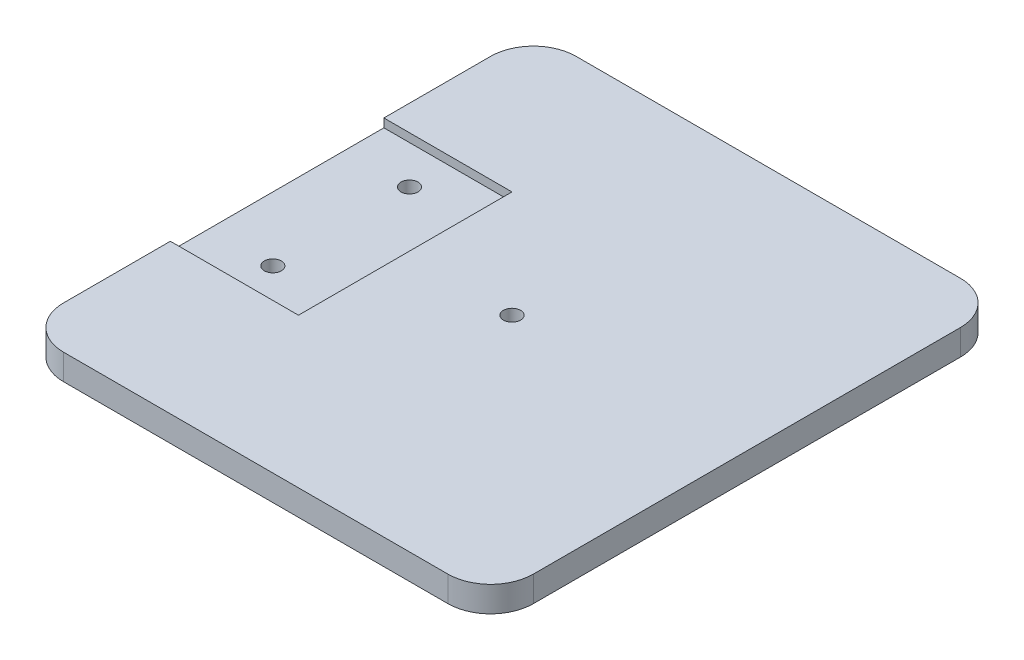
ISO-10303-21;
HEADER;
FILE_DESCRIPTION(('STEP AP214'),'2;1');
FILE_NAME('part.step','',(''),(''),'','','');
FILE_SCHEMA(('AUTOMOTIVE_DESIGN { 1 0 10303 214 1 1 1 1 }'));
ENDSEC;
DATA;
#1=APPLICATION_CONTEXT('core data for automotive mechanical design processes');
#2=APPLICATION_PROTOCOL_DEFINITION('international standard','automotive_design',2000,#1);
#3=PRODUCT_CONTEXT('',#1,'mechanical');
#4=PRODUCT('Part','Part','',(#3));
#5=PRODUCT_RELATED_PRODUCT_CATEGORY('part','',(#4));
#6=PRODUCT_DEFINITION_FORMATION('','',#4);
#7=PRODUCT_DEFINITION_CONTEXT('part definition',#1,'design');
#8=PRODUCT_DEFINITION('design','',#6,#7);
#9=PRODUCT_DEFINITION_SHAPE('','',#8);
#10=(LENGTH_UNIT() NAMED_UNIT(*) SI_UNIT(.MILLI.,.METRE.));
#11=(NAMED_UNIT(*) PLANE_ANGLE_UNIT() SI_UNIT($,.RADIAN.));
#12=(NAMED_UNIT(*) SI_UNIT($,.STERADIAN.) SOLID_ANGLE_UNIT());
#13=UNCERTAINTY_MEASURE_WITH_UNIT(LENGTH_MEASURE(1.E-05),#10,'distance_accuracy_value','');
#14=(GEOMETRIC_REPRESENTATION_CONTEXT(3) GLOBAL_UNCERTAINTY_ASSIGNED_CONTEXT((#13)) GLOBAL_UNIT_ASSIGNED_CONTEXT((#10,
#11,#12)) REPRESENTATION_CONTEXT('',''));
#15=CARTESIAN_POINT('',(0.,0.,0.));
#16=DIRECTION('',(0.,0.,1.));
#17=DIRECTION('',(1.,0.,0.));
#18=AXIS2_PLACEMENT_3D('',#15,#16,#17);
#19=CARTESIAN_POINT('',(-78.125,3.,-24.375));
#20=DIRECTION('',(1.,0.,0.));
#21=DIRECTION('',(0.,0.,-1.));
#22=AXIS2_PLACEMENT_3D('',#19,#20,#21);
#23=PLANE('',#22);
#24=DIRECTION('',(0.,0.,1.));
#25=VECTOR('',#24,1.);
#26=CARTESIAN_POINT('',(-78.125,3.,-24.375));
#27=LINE('',#26,#25);
#28=CARTESIAN_POINT('',(-78.125,3.,-19.375));
#29=VERTEX_POINT('',#28);
#30=CARTESIAN_POINT('',(-78.125,3.,-6.875));
#31=VERTEX_POINT('',#30);
#32=EDGE_CURVE('E172',#29,#31,#27,.T.);
#33=ORIENTED_EDGE('',*,*,#32,.F.);
#34=DIRECTION('',(0.,-1.,0.));
#35=VECTOR('',#34,1.);
#36=CARTESIAN_POINT('',(-78.125,3.,-19.375));
#37=LINE('',#36,#35);
#38=CARTESIAN_POINT('',(-78.125,0.,-19.375));
#39=VERTEX_POINT('',#38);
#40=EDGE_CURVE('E214',#29,#39,#37,.T.);
#41=ORIENTED_EDGE('',*,*,#40,.T.);
#42=DIRECTION('',(0.,0.,1.));
#43=VECTOR('',#42,1.);
#44=CARTESIAN_POINT('',(-78.125,0.,-24.375));
#45=LINE('',#44,#43);
#46=CARTESIAN_POINT('',(-78.125,0.,30.625));
#47=VERTEX_POINT('',#46);
#48=EDGE_CURVE('E186',#39,#47,#45,.T.);
#49=ORIENTED_EDGE('',*,*,#48,.T.);
#50=DIRECTION('',(0.,-1.,0.));
#51=VECTOR('',#50,1.);
#52=CARTESIAN_POINT('',(-78.125,3.,30.625));
#53=LINE('',#52,#51);
#54=CARTESIAN_POINT('',(-78.125,3.,30.625));
#55=VERTEX_POINT('',#54);
#56=EDGE_CURVE('E185',#47,#55,#53,.F.);
#57=ORIENTED_EDGE('',*,*,#56,.T.);
#58=CARTESIAN_POINT('',(-78.125,3.,18.125));
#59=VERTEX_POINT('',#58);
#60=EDGE_CURVE('E162',#59,#55,#27,.T.);
#61=ORIENTED_EDGE('',*,*,#60,.F.);
#62=DIRECTION('',(0.,1.,0.));
#63=VECTOR('',#62,1.);
#64=CARTESIAN_POINT('',(-78.125,2.,18.125));
#65=LINE('',#64,#63);
#66=CARTESIAN_POINT('',(-78.125,2.,18.125));
#67=VERTEX_POINT('',#66);
#68=EDGE_CURVE('E139',#67,#59,#65,.T.);
#69=ORIENTED_EDGE('',*,*,#68,.F.);
#70=DIRECTION('',(0.,0.,1.));
#71=VECTOR('',#70,1.);
#72=CARTESIAN_POINT('',(-78.125,2.,-6.875));
#73=LINE('',#72,#71);
#74=CARTESIAN_POINT('',(-78.125,2.,-6.875));
#75=VERTEX_POINT('',#74);
#76=EDGE_CURVE('E147',#75,#67,#73,.T.);
#77=ORIENTED_EDGE('',*,*,#76,.F.);
#78=DIRECTION('',(0.,1.,0.));
#79=VECTOR('',#78,1.);
#80=CARTESIAN_POINT('',(-78.125,2.,-6.875));
#81=LINE('',#80,#79);
#82=EDGE_CURVE('E191',#75,#31,#81,.T.);
#83=ORIENTED_EDGE('',*,*,#82,.T.);
#84=EDGE_LOOP('',(#33,#41,#49,#57,#61,#69,#77,#83));
#85=FACE_BOUND('',#84,.T.);
#86=ADVANCED_FACE('F43',(#85),#23,.F.);
#87=CARTESIAN_POINT('',(-78.125,3.,35.625));
#88=DIRECTION('',(0.,0.,-1.));
#89=DIRECTION('',(-1.,0.,0.));
#90=AXIS2_PLACEMENT_3D('',#87,#88,#89);
#91=PLANE('',#90);
#92=DIRECTION('',(1.,0.,0.));
#93=VECTOR('',#92,1.);
#94=CARTESIAN_POINT('',(-78.125,0.,35.625));
#95=LINE('',#94,#93);
#96=CARTESIAN_POINT('',(-73.125,0.,35.625));
#97=VERTEX_POINT('',#96);
#98=CARTESIAN_POINT('',(-28.125,0.,35.625));
#99=VERTEX_POINT('',#98);
#100=EDGE_CURVE('E190',#97,#99,#95,.T.);
#101=ORIENTED_EDGE('',*,*,#100,.T.);
#102=DIRECTION('',(0.,-1.,0.));
#103=VECTOR('',#102,1.);
#104=CARTESIAN_POINT('',(-28.125,3.,35.625));
#105=LINE('',#104,#103);
#106=CARTESIAN_POINT('',(-28.125,3.,35.625));
#107=VERTEX_POINT('',#106);
#108=EDGE_CURVE('E11',#99,#107,#105,.F.);
#109=ORIENTED_EDGE('',*,*,#108,.T.);
#110=DIRECTION('',(1.,0.,0.));
#111=VECTOR('',#110,1.);
#112=CARTESIAN_POINT('',(-78.125,3.,35.625));
#113=LINE('',#112,#111);
#114=CARTESIAN_POINT('',(-73.125,3.,35.625));
#115=VERTEX_POINT('',#114);
#116=EDGE_CURVE('E175',#115,#107,#113,.T.);
#117=ORIENTED_EDGE('',*,*,#116,.F.);
#118=DIRECTION('',(0.,-1.,0.));
#119=VECTOR('',#118,1.);
#120=CARTESIAN_POINT('',(-73.125,3.,35.625));
#121=LINE('',#120,#119);
#122=EDGE_CURVE('E53',#115,#97,#121,.T.);
#123=ORIENTED_EDGE('',*,*,#122,.T.);
#124=EDGE_LOOP('',(#101,#109,#117,#123));
#125=FACE_BOUND('',#124,.T.);
#126=ADVANCED_FACE('F260',(#125),#91,.F.);
#127=CARTESIAN_POINT('',(-23.125,3.,-24.375));
#128=DIRECTION('',(-1.,0.,0.));
#129=DIRECTION('',(0.,0.,1.));
#130=AXIS2_PLACEMENT_3D('',#127,#128,#129);
#131=PLANE('',#130);
#132=DIRECTION('',(0.,0.,-1.));
#133=VECTOR('',#132,1.);
#134=CARTESIAN_POINT('',(-23.125,0.,-24.375));
#135=LINE('',#134,#133);
#136=CARTESIAN_POINT('',(-23.125,0.,30.625));
#137=VERTEX_POINT('',#136);
#138=CARTESIAN_POINT('',(-23.125,0.,-19.375));
#139=VERTEX_POINT('',#138);
#140=EDGE_CURVE('E195',#137,#139,#135,.T.);
#141=ORIENTED_EDGE('',*,*,#140,.T.);
#142=DIRECTION('',(0.,-1.,0.));
#143=VECTOR('',#142,1.);
#144=CARTESIAN_POINT('',(-23.125,3.,-19.375));
#145=LINE('',#144,#143);
#146=CARTESIAN_POINT('',(-23.125,3.,-19.375));
#147=VERTEX_POINT('',#146);
#148=EDGE_CURVE('E60',#139,#147,#145,.F.);
#149=ORIENTED_EDGE('',*,*,#148,.T.);
#150=DIRECTION('',(0.,0.,-1.));
#151=VECTOR('',#150,1.);
#152=CARTESIAN_POINT('',(-23.125,3.,-24.375));
#153=LINE('',#152,#151);
#154=CARTESIAN_POINT('',(-23.125,3.,30.625));
#155=VERTEX_POINT('',#154);
#156=EDGE_CURVE('E178',#155,#147,#153,.T.);
#157=ORIENTED_EDGE('',*,*,#156,.F.);
#158=DIRECTION('',(0.,-1.,0.));
#159=VECTOR('',#158,1.);
#160=CARTESIAN_POINT('',(-23.125,3.,30.625));
#161=LINE('',#160,#159);
#162=EDGE_CURVE('E248',#155,#137,#161,.T.);
#163=ORIENTED_EDGE('',*,*,#162,.T.);
#164=EDGE_LOOP('',(#141,#149,#157,#163));
#165=FACE_BOUND('',#164,.T.);
#166=ADVANCED_FACE('F271',(#165),#131,.F.);
#167=CARTESIAN_POINT('',(-78.125,3.,-24.375));
#168=DIRECTION('',(0.,0.,1.));
#169=DIRECTION('',(1.,0.,0.));
#170=AXIS2_PLACEMENT_3D('',#167,#168,#169);
#171=PLANE('',#170);
#172=DIRECTION('',(-1.,0.,0.));
#173=VECTOR('',#172,1.);
#174=CARTESIAN_POINT('',(-78.125,0.,-24.375));
#175=LINE('',#174,#173);
#176=CARTESIAN_POINT('',(-28.125,0.,-24.375));
#177=VERTEX_POINT('',#176);
#178=CARTESIAN_POINT('',(-73.125,0.,-24.375));
#179=VERTEX_POINT('',#178);
#180=EDGE_CURVE('E198',#177,#179,#175,.T.);
#181=ORIENTED_EDGE('',*,*,#180,.T.);
#182=DIRECTION('',(0.,-1.,0.));
#183=VECTOR('',#182,1.);
#184=CARTESIAN_POINT('',(-73.125,3.,-24.375));
#185=LINE('',#184,#183);
#186=CARTESIAN_POINT('',(-73.125,3.,-24.375));
#187=VERTEX_POINT('',#186);
#188=EDGE_CURVE('E234',#179,#187,#185,.F.);
#189=ORIENTED_EDGE('',*,*,#188,.T.);
#190=DIRECTION('',(-1.,0.,0.));
#191=VECTOR('',#190,1.);
#192=CARTESIAN_POINT('',(-78.125,3.,-24.375));
#193=LINE('',#192,#191);
#194=CARTESIAN_POINT('',(-28.125,3.,-24.375));
#195=VERTEX_POINT('',#194);
#196=EDGE_CURVE('E181',#195,#187,#193,.T.);
#197=ORIENTED_EDGE('',*,*,#196,.F.);
#198=DIRECTION('',(0.,-1.,0.));
#199=VECTOR('',#198,1.);
#200=CARTESIAN_POINT('',(-28.125,3.,-24.375));
#201=LINE('',#200,#199);
#202=EDGE_CURVE('E230',#195,#177,#201,.T.);
#203=ORIENTED_EDGE('',*,*,#202,.T.);
#204=EDGE_LOOP('',(#181,#189,#197,#203));
#205=FACE_BOUND('',#204,.T.);
#206=ADVANCED_FACE('F280',(#205),#171,.F.);
#207=CARTESIAN_POINT('',(0.,3.,0.));
#208=DIRECTION('',(0.,1.,0.));
#209=DIRECTION('',(0.,0.,1.));
#210=AXIS2_PLACEMENT_3D('',#207,#208,#209);
#211=PLANE('',#210);
#212=CARTESIAN_POINT('',(-50.625,3.,5.625));
#213=DIRECTION('',(0.,1.,0.));
#214=DIRECTION('',(0.,0.,1.));
#215=AXIS2_PLACEMENT_3D('',#212,#213,#214);
#216=CIRCLE('',#215,0.999999999999998);
#217=CARTESIAN_POINT('',(-50.625,3.,6.625));
#218=VERTEX_POINT('',#217);
#219=EDGE_CURVE('E493',#218,#218,#216,.T.);
#220=ORIENTED_EDGE('',*,*,#219,.F.);
#221=EDGE_LOOP('',(#220));
#222=FACE_BOUND('',#221,.T.);
#223=ORIENTED_EDGE('',*,*,#196,.T.);
#224=CARTESIAN_POINT('',(-73.125,3.,-19.375));
#225=DIRECTION('',(0.,1.,0.));
#226=DIRECTION('',(0.,0.,1.));
#227=AXIS2_PLACEMENT_3D('',#224,#225,#226);
#228=CIRCLE('',#227,5.);
#229=EDGE_CURVE('E245',#187,#29,#228,.T.);
#230=ORIENTED_EDGE('',*,*,#229,.T.);
#231=ORIENTED_EDGE('',*,*,#32,.T.);
#232=DIRECTION('',(-1.,0.,0.));
#233=VECTOR('',#232,1.);
#234=CARTESIAN_POINT('',(-78.125,3.,-6.875));
#235=LINE('',#234,#233);
#236=CARTESIAN_POINT('',(-63.125,3.,-6.875));
#237=VERTEX_POINT('',#236);
#238=EDGE_CURVE('E157',#237,#31,#235,.T.);
#239=ORIENTED_EDGE('',*,*,#238,.F.);
#240=DIRECTION('',(0.,0.,-1.));
#241=VECTOR('',#240,1.);
#242=CARTESIAN_POINT('',(-63.125,3.,-6.875));
#243=LINE('',#242,#241);
#244=CARTESIAN_POINT('',(-63.125,3.,18.125));
#245=VERTEX_POINT('',#244);
#246=EDGE_CURVE('E294',#245,#237,#243,.T.);
#247=ORIENTED_EDGE('',*,*,#246,.F.);
#248=DIRECTION('',(1.,0.,0.));
#249=VECTOR('',#248,1.);
#250=CARTESIAN_POINT('',(-78.125,3.,18.125));
#251=LINE('',#250,#249);
#252=EDGE_CURVE('E297',#59,#245,#251,.T.);
#253=ORIENTED_EDGE('',*,*,#252,.F.);
#254=ORIENTED_EDGE('',*,*,#60,.T.);
#255=CARTESIAN_POINT('',(-73.125,3.,30.625));
#256=DIRECTION('',(0.,1.,0.));
#257=DIRECTION('',(0.,0.,1.));
#258=AXIS2_PLACEMENT_3D('',#255,#256,#257);
#259=CIRCLE('',#258,5.);
#260=EDGE_CURVE('E237',#55,#115,#259,.T.);
#261=ORIENTED_EDGE('',*,*,#260,.T.);
#262=ORIENTED_EDGE('',*,*,#116,.T.);
#263=CARTESIAN_POINT('',(-28.125,3.,30.625));
#264=DIRECTION('',(0.,1.,0.));
#265=DIRECTION('',(0.,0.,1.));
#266=AXIS2_PLACEMENT_3D('',#263,#264,#265);
#267=CIRCLE('',#266,5.);
#268=EDGE_CURVE('E67',#107,#155,#267,.T.);
#269=ORIENTED_EDGE('',*,*,#268,.T.);
#270=ORIENTED_EDGE('',*,*,#156,.T.);
#271=CARTESIAN_POINT('',(-28.125,3.,-19.375));
#272=DIRECTION('',(0.,1.,0.));
#273=DIRECTION('',(0.,0.,1.));
#274=AXIS2_PLACEMENT_3D('',#271,#272,#273);
#275=CIRCLE('',#274,5.);
#276=EDGE_CURVE('E242',#147,#195,#275,.T.);
#277=ORIENTED_EDGE('',*,*,#276,.T.);
#278=EDGE_LOOP('',(#223,#230,#231,#239,#247,#253,#254,#261,#262,#269,#270,#277));
#279=FACE_BOUND('',#278,.T.);
#280=ADVANCED_FACE('F273',(#222,#279),#211,.T.);
#281=CARTESIAN_POINT('',(0.,0.,0.));
#282=DIRECTION('',(0.,1.,0.));
#283=DIRECTION('',(0.,0.,1.));
#284=AXIS2_PLACEMENT_3D('',#281,#282,#283);
#285=PLANE('',#284);
#286=CARTESIAN_POINT('',(-50.625,0.,5.625));
#287=DIRECTION('',(0.,1.,0.));
#288=DIRECTION('',(0.,0.,1.));
#289=AXIS2_PLACEMENT_3D('',#286,#287,#288);
#290=CIRCLE('',#289,0.999999999999998);
#291=CARTESIAN_POINT('',(-50.625,0.,6.625));
#292=VERTEX_POINT('',#291);
#293=EDGE_CURVE('E47',#292,#292,#290,.T.);
#294=ORIENTED_EDGE('',*,*,#293,.T.);
#295=EDGE_LOOP('',(#294));
#296=FACE_BOUND('',#295,.T.);
#297=CARTESIAN_POINT('',(-70.625,0.,-2.375));
#298=DIRECTION('',(0.,1.,0.));
#299=DIRECTION('',(0.,0.,1.));
#300=AXIS2_PLACEMENT_3D('',#297,#298,#299);
#301=CIRCLE('',#300,0.999999999999998);
#302=CARTESIAN_POINT('',(-70.625,0.,-1.375));
#303=VERTEX_POINT('',#302);
#304=EDGE_CURVE('E211',#303,#303,#301,.T.);
#305=ORIENTED_EDGE('',*,*,#304,.T.);
#306=EDGE_LOOP('',(#305));
#307=FACE_BOUND('',#306,.T.);
#308=CARTESIAN_POINT('',(-70.625,0.,13.625));
#309=DIRECTION('',(0.,1.,0.));
#310=DIRECTION('',(0.,0.,1.));
#311=AXIS2_PLACEMENT_3D('',#308,#309,#310);
#312=CIRCLE('',#311,0.999999999999998);
#313=CARTESIAN_POINT('',(-70.625,0.,14.625));
#314=VERTEX_POINT('',#313);
#315=EDGE_CURVE('E206',#314,#314,#312,.T.);
#316=ORIENTED_EDGE('',*,*,#315,.T.);
#317=EDGE_LOOP('',(#316));
#318=FACE_BOUND('',#317,.T.);
#319=ORIENTED_EDGE('',*,*,#48,.F.);
#320=CARTESIAN_POINT('',(-73.125,0.,-19.375));
#321=DIRECTION('',(0.,1.,0.));
#322=DIRECTION('',(0.,0.,1.));
#323=AXIS2_PLACEMENT_3D('',#320,#321,#322);
#324=CIRCLE('',#323,5.);
#325=EDGE_CURVE('E227',#39,#179,#324,.F.);
#326=ORIENTED_EDGE('',*,*,#325,.T.);
#327=ORIENTED_EDGE('',*,*,#180,.F.);
#328=CARTESIAN_POINT('',(-28.125,0.,-19.375));
#329=DIRECTION('',(0.,1.,0.));
#330=DIRECTION('',(0.,0.,1.));
#331=AXIS2_PLACEMENT_3D('',#328,#329,#330);
#332=CIRCLE('',#331,5.);
#333=EDGE_CURVE('E224',#177,#139,#332,.F.);
#334=ORIENTED_EDGE('',*,*,#333,.T.);
#335=ORIENTED_EDGE('',*,*,#140,.F.);
#336=CARTESIAN_POINT('',(-28.125,0.,30.625));
#337=DIRECTION('',(0.,1.,0.));
#338=DIRECTION('',(0.,0.,1.));
#339=AXIS2_PLACEMENT_3D('',#336,#337,#338);
#340=CIRCLE('',#339,5.);
#341=EDGE_CURVE('E221',#137,#99,#340,.F.);
#342=ORIENTED_EDGE('',*,*,#341,.T.);
#343=ORIENTED_EDGE('',*,*,#100,.F.);
#344=CARTESIAN_POINT('',(-73.125,0.,30.625));
#345=DIRECTION('',(0.,1.,0.));
#346=DIRECTION('',(0.,0.,1.));
#347=AXIS2_PLACEMENT_3D('',#344,#345,#346);
#348=CIRCLE('',#347,5.);
#349=EDGE_CURVE('E218',#97,#47,#348,.F.);
#350=ORIENTED_EDGE('',*,*,#349,.T.);
#351=EDGE_LOOP('',(#319,#326,#327,#334,#335,#342,#343,#350));
#352=FACE_BOUND('',#351,.T.);
#353=ADVANCED_FACE('F266',(#296,#307,#318,#352),#285,.F.);
#354=CARTESIAN_POINT('',(-78.125,2.,-6.875));
#355=DIRECTION('',(0.,0.,-1.));
#356=DIRECTION('',(-1.,0.,0.));
#357=AXIS2_PLACEMENT_3D('',#354,#355,#356);
#358=PLANE('',#357);
#359=ORIENTED_EDGE('',*,*,#238,.T.);
#360=ORIENTED_EDGE('',*,*,#82,.F.);
#361=DIRECTION('',(-1.,0.,0.));
#362=VECTOR('',#361,1.);
#363=CARTESIAN_POINT('',(-78.125,2.,-6.875));
#364=LINE('',#363,#362);
#365=CARTESIAN_POINT('',(-63.125,2.,-6.875));
#366=VERTEX_POINT('',#365);
#367=EDGE_CURVE('E153',#366,#75,#364,.T.);
#368=ORIENTED_EDGE('',*,*,#367,.F.);
#369=DIRECTION('',(0.,1.,0.));
#370=VECTOR('',#369,1.);
#371=CARTESIAN_POINT('',(-63.125,2.,-6.875));
#372=LINE('',#371,#370);
#373=EDGE_CURVE('E167',#366,#237,#372,.T.);
#374=ORIENTED_EDGE('',*,*,#373,.T.);
#375=EDGE_LOOP('',(#359,#360,#368,#374));
#376=FACE_BOUND('',#375,.T.);
#377=ADVANCED_FACE('F291',(#376),#358,.F.);
#378=CARTESIAN_POINT('',(-63.125,2.,-6.875));
#379=DIRECTION('',(1.,0.,0.));
#380=DIRECTION('',(0.,0.,-1.));
#381=AXIS2_PLACEMENT_3D('',#378,#379,#380);
#382=PLANE('',#381);
#383=ORIENTED_EDGE('',*,*,#246,.T.);
#384=ORIENTED_EDGE('',*,*,#373,.F.);
#385=DIRECTION('',(0.,0.,-1.));
#386=VECTOR('',#385,1.);
#387=CARTESIAN_POINT('',(-63.125,2.,-6.875));
#388=LINE('',#387,#386);
#389=CARTESIAN_POINT('',(-63.125,2.,18.125));
#390=VERTEX_POINT('',#389);
#391=EDGE_CURVE('E146',#390,#366,#388,.T.);
#392=ORIENTED_EDGE('',*,*,#391,.F.);
#393=DIRECTION('',(0.,1.,0.));
#394=VECTOR('',#393,1.);
#395=CARTESIAN_POINT('',(-63.125,2.,18.125));
#396=LINE('',#395,#394);
#397=EDGE_CURVE('E141',#390,#245,#396,.T.);
#398=ORIENTED_EDGE('',*,*,#397,.T.);
#399=EDGE_LOOP('',(#383,#384,#392,#398));
#400=FACE_BOUND('',#399,.T.);
#401=ADVANCED_FACE('F418',(#400),#382,.F.);
#402=CARTESIAN_POINT('',(-78.125,2.,18.125));
#403=DIRECTION('',(0.,0.,1.));
#404=DIRECTION('',(1.,0.,0.));
#405=AXIS2_PLACEMENT_3D('',#402,#403,#404);
#406=PLANE('',#405);
#407=ORIENTED_EDGE('',*,*,#252,.T.);
#408=ORIENTED_EDGE('',*,*,#397,.F.);
#409=DIRECTION('',(1.,0.,0.));
#410=VECTOR('',#409,1.);
#411=CARTESIAN_POINT('',(-78.125,2.,18.125));
#412=LINE('',#411,#410);
#413=EDGE_CURVE('E134',#67,#390,#412,.T.);
#414=ORIENTED_EDGE('',*,*,#413,.F.);
#415=ORIENTED_EDGE('',*,*,#68,.T.);
#416=EDGE_LOOP('',(#407,#408,#414,#415));
#417=FACE_BOUND('',#416,.T.);
#418=ADVANCED_FACE('F137',(#417),#406,.F.);
#419=CARTESIAN_POINT('',(0.,2.,0.));
#420=DIRECTION('',(0.,1.,0.));
#421=DIRECTION('',(0.,0.,1.));
#422=AXIS2_PLACEMENT_3D('',#419,#420,#421);
#423=PLANE('',#422);
#424=CARTESIAN_POINT('',(-70.625,2.,-2.375));
#425=DIRECTION('',(0.,1.,0.));
#426=DIRECTION('',(0.,0.,1.));
#427=AXIS2_PLACEMENT_3D('',#424,#425,#426);
#428=CIRCLE('',#427,0.999999999999998);
#429=CARTESIAN_POINT('',(-70.625,2.,-1.375));
#430=VERTEX_POINT('',#429);
#431=EDGE_CURVE('E207',#430,#430,#428,.T.);
#432=ORIENTED_EDGE('',*,*,#431,.F.);
#433=EDGE_LOOP('',(#432));
#434=FACE_BOUND('',#433,.T.);
#435=CARTESIAN_POINT('',(-70.625,2.,13.625));
#436=DIRECTION('',(0.,1.,0.));
#437=DIRECTION('',(0.,0.,1.));
#438=AXIS2_PLACEMENT_3D('',#435,#436,#437);
#439=CIRCLE('',#438,0.999999999999998);
#440=CARTESIAN_POINT('',(-70.625,2.,14.625));
#441=VERTEX_POINT('',#440);
#442=EDGE_CURVE('E202',#441,#441,#439,.T.);
#443=ORIENTED_EDGE('',*,*,#442,.F.);
#444=EDGE_LOOP('',(#443));
#445=FACE_BOUND('',#444,.T.);
#446=ORIENTED_EDGE('',*,*,#76,.T.);
#447=ORIENTED_EDGE('',*,*,#413,.T.);
#448=ORIENTED_EDGE('',*,*,#391,.T.);
#449=ORIENTED_EDGE('',*,*,#367,.T.);
#450=EDGE_LOOP('',(#446,#447,#448,#449));
#451=FACE_BOUND('',#450,.T.);
#452=ADVANCED_FACE('F151',(#434,#445,#451),#423,.T.);
#453=CARTESIAN_POINT('',(-70.625,-2.,13.625));
#454=DIRECTION('',(0.,1.,0.));
#455=DIRECTION('',(0.,0.,1.));
#456=AXIS2_PLACEMENT_3D('',#453,#454,#455);
#457=CYLINDRICAL_SURFACE('',#456,0.999999999999998);
#458=ORIENTED_EDGE('',*,*,#442,.T.);
#459=EDGE_LOOP('',(#458));
#460=FACE_BOUND('',#459,.T.);
#461=ORIENTED_EDGE('',*,*,#315,.F.);
#462=EDGE_LOOP('',(#461));
#463=FACE_BOUND('',#462,.T.);
#464=ADVANCED_FACE('F390',(#460,#463),#457,.F.);
#465=CARTESIAN_POINT('',(-70.625,-2.,-2.375));
#466=DIRECTION('',(0.,1.,0.));
#467=DIRECTION('',(0.,0.,1.));
#468=AXIS2_PLACEMENT_3D('',#465,#466,#467);
#469=CYLINDRICAL_SURFACE('',#468,0.999999999999998);
#470=ORIENTED_EDGE('',*,*,#431,.T.);
#471=EDGE_LOOP('',(#470));
#472=FACE_BOUND('',#471,.T.);
#473=ORIENTED_EDGE('',*,*,#304,.F.);
#474=EDGE_LOOP('',(#473));
#475=FACE_BOUND('',#474,.T.);
#476=ADVANCED_FACE('F322',(#472,#475),#469,.F.);
#477=CARTESIAN_POINT('',(-73.125,3.,-19.375));
#478=DIRECTION('',(0.,-1.,0.));
#479=DIRECTION('',(0.,0.,-1.));
#480=AXIS2_PLACEMENT_3D('',#477,#478,#479);
#481=CYLINDRICAL_SURFACE('',#480,5.);
#482=ORIENTED_EDGE('',*,*,#229,.F.);
#483=ORIENTED_EDGE('',*,*,#188,.F.);
#484=ORIENTED_EDGE('',*,*,#325,.F.);
#485=ORIENTED_EDGE('',*,*,#40,.F.);
#486=EDGE_LOOP('',(#482,#483,#484,#485));
#487=FACE_BOUND('',#486,.T.);
#488=ADVANCED_FACE('F285',(#487),#481,.T.);
#489=CARTESIAN_POINT('',(-28.125,3.,-19.375));
#490=DIRECTION('',(0.,-1.,0.));
#491=DIRECTION('',(0.,0.,-1.));
#492=AXIS2_PLACEMENT_3D('',#489,#490,#491);
#493=CYLINDRICAL_SURFACE('',#492,5.);
#494=ORIENTED_EDGE('',*,*,#276,.F.);
#495=ORIENTED_EDGE('',*,*,#148,.F.);
#496=ORIENTED_EDGE('',*,*,#333,.F.);
#497=ORIENTED_EDGE('',*,*,#202,.F.);
#498=EDGE_LOOP('',(#494,#495,#496,#497));
#499=FACE_BOUND('',#498,.T.);
#500=ADVANCED_FACE('F277',(#499),#493,.T.);
#501=CARTESIAN_POINT('',(-28.125,3.,30.625));
#502=DIRECTION('',(0.,-1.,0.));
#503=DIRECTION('',(0.,0.,-1.));
#504=AXIS2_PLACEMENT_3D('',#501,#502,#503);
#505=CYLINDRICAL_SURFACE('',#504,5.);
#506=ORIENTED_EDGE('',*,*,#268,.F.);
#507=ORIENTED_EDGE('',*,*,#108,.F.);
#508=ORIENTED_EDGE('',*,*,#341,.F.);
#509=ORIENTED_EDGE('',*,*,#162,.F.);
#510=EDGE_LOOP('',(#506,#507,#508,#509));
#511=FACE_BOUND('',#510,.T.);
#512=ADVANCED_FACE('F270',(#511),#505,.T.);
#513=CARTESIAN_POINT('',(-73.125,3.,30.625));
#514=DIRECTION('',(0.,-1.,0.));
#515=DIRECTION('',(0.,0.,-1.));
#516=AXIS2_PLACEMENT_3D('',#513,#514,#515);
#517=CYLINDRICAL_SURFACE('',#516,5.);
#518=ORIENTED_EDGE('',*,*,#260,.F.);
#519=ORIENTED_EDGE('',*,*,#56,.F.);
#520=ORIENTED_EDGE('',*,*,#349,.F.);
#521=ORIENTED_EDGE('',*,*,#122,.F.);
#522=EDGE_LOOP('',(#518,#519,#520,#521));
#523=FACE_BOUND('',#522,.T.);
#524=ADVANCED_FACE('F45',(#523),#517,.T.);
#525=CARTESIAN_POINT('',(-50.625,-2.,5.625));
#526=DIRECTION('',(0.,1.,0.));
#527=DIRECTION('',(0.,0.,1.));
#528=AXIS2_PLACEMENT_3D('',#525,#526,#527);
#529=CYLINDRICAL_SURFACE('',#528,0.999999999999998);
#530=ORIENTED_EDGE('',*,*,#219,.T.);
#531=EDGE_LOOP('',(#530));
#532=FACE_BOUND('',#531,.T.);
#533=ORIENTED_EDGE('',*,*,#293,.F.);
#534=EDGE_LOOP('',(#533));
#535=FACE_BOUND('',#534,.T.);
#536=ADVANCED_FACE('F305',(#532,#535),#529,.F.);
#537=CLOSED_SHELL('',(#86,#126,#166,#206,#280,#353,#377,#401,#418,#452,#464,#476,#488,#500,#512,
#524,#536));
#538=MANIFOLD_SOLID_BREP('B2',#537);
#539=ADVANCED_BREP_SHAPE_REPRESENTATION('',(#18,#538),#14);
#540=SHAPE_DEFINITION_REPRESENTATION(#9,#539);
ENDSEC;
END-ISO-10303-21;
